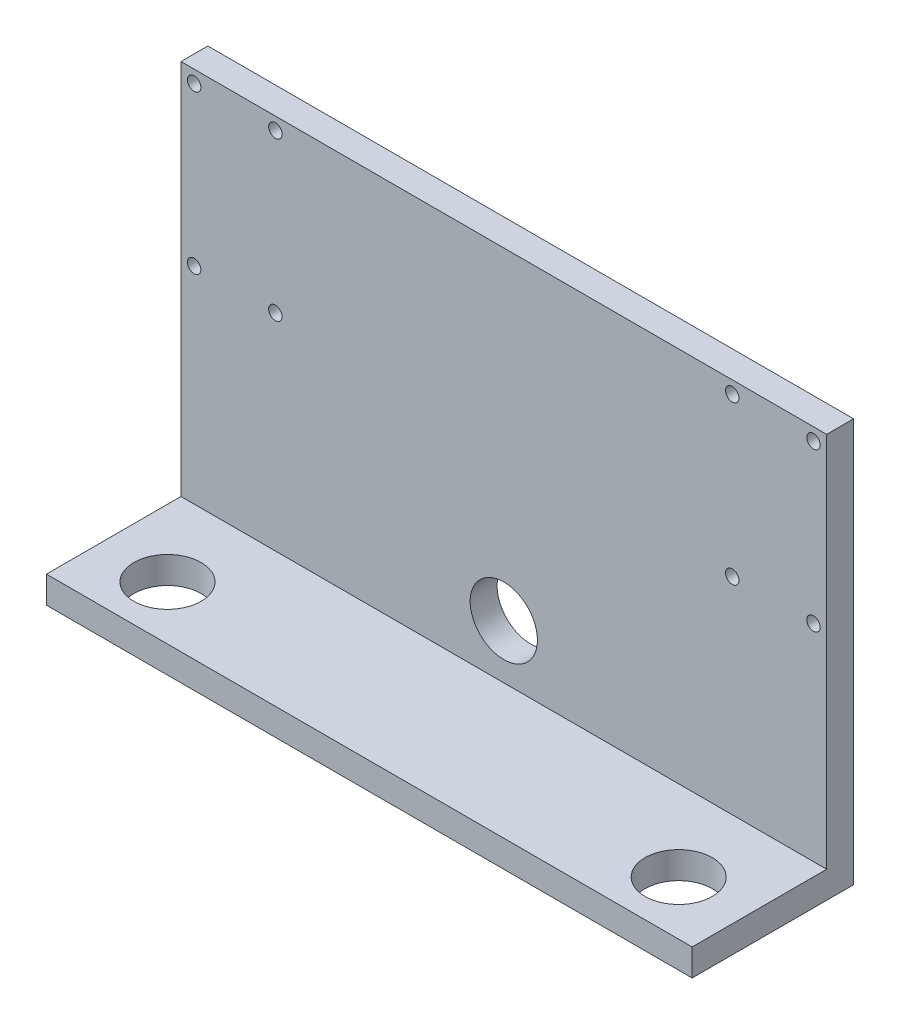
ISO-10303-21;
HEADER;
FILE_DESCRIPTION(('STEP AP214'),'2;1');
FILE_NAME('part.step','',(''),(''),'','','');
FILE_SCHEMA(('AUTOMOTIVE_DESIGN { 1 0 10303 214 1 1 1 1 }'));
ENDSEC;
DATA;
#1=APPLICATION_CONTEXT('core data for automotive mechanical design processes');
#2=APPLICATION_PROTOCOL_DEFINITION('international standard','automotive_design',2000,#1);
#3=PRODUCT_CONTEXT('',#1,'mechanical');
#4=PRODUCT('Part','Part','',(#3));
#5=PRODUCT_RELATED_PRODUCT_CATEGORY('part','',(#4));
#6=PRODUCT_DEFINITION_FORMATION('','',#4);
#7=PRODUCT_DEFINITION_CONTEXT('part definition',#1,'design');
#8=PRODUCT_DEFINITION('design','',#6,#7);
#9=PRODUCT_DEFINITION_SHAPE('','',#8);
#10=(LENGTH_UNIT() NAMED_UNIT(*) SI_UNIT(.MILLI.,.METRE.));
#11=(NAMED_UNIT(*) PLANE_ANGLE_UNIT() SI_UNIT($,.RADIAN.));
#12=(NAMED_UNIT(*) SI_UNIT($,.STERADIAN.) SOLID_ANGLE_UNIT());
#13=UNCERTAINTY_MEASURE_WITH_UNIT(LENGTH_MEASURE(1.E-05),#10,'distance_accuracy_value','');
#14=(GEOMETRIC_REPRESENTATION_CONTEXT(3) GLOBAL_UNCERTAINTY_ASSIGNED_CONTEXT((#13)) GLOBAL_UNIT_ASSIGNED_CONTEXT((#10,
#11,#12)) REPRESENTATION_CONTEXT('',''));
#15=CARTESIAN_POINT('',(0.,0.,0.));
#16=DIRECTION('',(0.,0.,1.));
#17=DIRECTION('',(1.,0.,0.));
#18=AXIS2_PLACEMENT_3D('',#15,#16,#17);
#19=CARTESIAN_POINT('',(-120.,150.,-20.));
#20=DIRECTION('',(0.,0.,-1.));
#21=DIRECTION('',(-1.,0.,0.));
#22=AXIS2_PLACEMENT_3D('',#19,#20,#21);
#23=PLANE('',#22);
#24=CARTESIAN_POINT('',(0.,30.,-20.));
#25=DIRECTION('',(0.,0.,1.));
#26=DIRECTION('',(1.,0.,0.));
#27=AXIS2_PLACEMENT_3D('',#24,#25,#26);
#28=CIRCLE('',#27,12.5);
#29=CARTESIAN_POINT('',(12.5,30.,-20.));
#30=VERTEX_POINT('',#29);
#31=EDGE_CURVE('E186',#30,#30,#28,.T.);
#32=ORIENTED_EDGE('',*,*,#31,.F.);
#33=EDGE_LOOP('',(#32));
#34=FACE_BOUND('',#33,.T.);
#35=DIRECTION('',(1.,0.,0.));
#36=VECTOR('',#35,1.);
#37=CARTESIAN_POINT('',(-120.,10.,-20.));
#38=LINE('',#37,#36);
#39=CARTESIAN_POINT('',(-120.,10.,-20.));
#40=VERTEX_POINT('',#39);
#41=CARTESIAN_POINT('',(120.,10.,-20.));
#42=VERTEX_POINT('',#41);
#43=EDGE_CURVE('E34',#40,#42,#38,.T.);
#44=ORIENTED_EDGE('',*,*,#43,.T.);
#45=DIRECTION('',(0.,-1.,0.));
#46=VECTOR('',#45,1.);
#47=CARTESIAN_POINT('',(120.,150.,-20.));
#48=LINE('',#47,#46);
#49=CARTESIAN_POINT('',(120.,150.,-20.));
#50=VERTEX_POINT('',#49);
#51=EDGE_CURVE('E84',#50,#42,#48,.T.);
#52=ORIENTED_EDGE('',*,*,#51,.F.);
#53=DIRECTION('',(1.,0.,0.));
#54=VECTOR('',#53,1.);
#55=CARTESIAN_POINT('',(-120.,150.,-20.));
#56=LINE('',#55,#54);
#57=CARTESIAN_POINT('',(-120.,150.,-20.));
#58=VERTEX_POINT('',#57);
#59=EDGE_CURVE('E118',#58,#50,#56,.T.);
#60=ORIENTED_EDGE('',*,*,#59,.F.);
#61=DIRECTION('',(0.,-1.,0.));
#62=VECTOR('',#61,1.);
#63=CARTESIAN_POINT('',(-120.,150.,-20.));
#64=LINE('',#63,#62);
#65=EDGE_CURVE('E80',#58,#40,#64,.T.);
#66=ORIENTED_EDGE('',*,*,#65,.T.);
#67=EDGE_LOOP('',(#44,#52,#60,#66));
#68=FACE_BOUND('',#67,.T.);
#69=CARTESIAN_POINT('',(84.9,86.6500000000607,-20.));
#70=DIRECTION('',(0.,0.,1.));
#71=DIRECTION('',(1.,0.,0.));
#72=AXIS2_PLACEMENT_3D('',#69,#70,#71);
#73=CIRCLE('',#72,2.5);
#74=CARTESIAN_POINT('',(87.4,86.6500000000607,-20.));
#75=VERTEX_POINT('',#74);
#76=EDGE_CURVE('E138',#75,#75,#73,.T.);
#77=ORIENTED_EDGE('',*,*,#76,.F.);
#78=EDGE_LOOP('',(#77));
#79=FACE_BOUND('',#78,.T.);
#80=CARTESIAN_POINT('',(115.1,86.6500000000607,-20.));
#81=DIRECTION('',(0.,0.,1.));
#82=DIRECTION('',(1.,0.,0.));
#83=AXIS2_PLACEMENT_3D('',#80,#81,#82);
#84=CIRCLE('',#83,2.5);
#85=CARTESIAN_POINT('',(117.6,86.6500000000607,-20.));
#86=VERTEX_POINT('',#85);
#87=EDGE_CURVE('E144',#86,#86,#84,.T.);
#88=ORIENTED_EDGE('',*,*,#87,.F.);
#89=EDGE_LOOP('',(#88));
#90=FACE_BOUND('',#89,.T.);
#91=CARTESIAN_POINT('',(115.1,145.350000000061,-20.));
#92=DIRECTION('',(0.,0.,1.));
#93=DIRECTION('',(1.,0.,0.));
#94=AXIS2_PLACEMENT_3D('',#91,#92,#93);
#95=CIRCLE('',#94,2.5);
#96=CARTESIAN_POINT('',(117.6,145.350000000061,-20.));
#97=VERTEX_POINT('',#96);
#98=EDGE_CURVE('E150',#97,#97,#95,.T.);
#99=ORIENTED_EDGE('',*,*,#98,.F.);
#100=EDGE_LOOP('',(#99));
#101=FACE_BOUND('',#100,.T.);
#102=CARTESIAN_POINT('',(84.9,145.350000000061,-20.));
#103=DIRECTION('',(0.,0.,1.));
#104=DIRECTION('',(1.,0.,0.));
#105=AXIS2_PLACEMENT_3D('',#102,#103,#104);
#106=CIRCLE('',#105,2.5);
#107=CARTESIAN_POINT('',(87.4,145.350000000061,-20.));
#108=VERTEX_POINT('',#107);
#109=EDGE_CURVE('E156',#108,#108,#106,.T.);
#110=ORIENTED_EDGE('',*,*,#109,.F.);
#111=EDGE_LOOP('',(#110));
#112=FACE_BOUND('',#111,.T.);
#113=CARTESIAN_POINT('',(-115.1,86.6500000000607,-20.));
#114=DIRECTION('',(0.,0.,1.));
#115=DIRECTION('',(1.,0.,0.));
#116=AXIS2_PLACEMENT_3D('',#113,#114,#115);
#117=CIRCLE('',#116,2.5);
#118=CARTESIAN_POINT('',(-112.6,86.6500000000607,-20.));
#119=VERTEX_POINT('',#118);
#120=EDGE_CURVE('E162',#119,#119,#117,.T.);
#121=ORIENTED_EDGE('',*,*,#120,.F.);
#122=EDGE_LOOP('',(#121));
#123=FACE_BOUND('',#122,.T.);
#124=CARTESIAN_POINT('',(-84.9,86.6500000000607,-20.));
#125=DIRECTION('',(0.,0.,1.));
#126=DIRECTION('',(1.,0.,0.));
#127=AXIS2_PLACEMENT_3D('',#124,#125,#126);
#128=CIRCLE('',#127,2.5);
#129=CARTESIAN_POINT('',(-82.4,86.6500000000607,-20.));
#130=VERTEX_POINT('',#129);
#131=EDGE_CURVE('E168',#130,#130,#128,.T.);
#132=ORIENTED_EDGE('',*,*,#131,.F.);
#133=EDGE_LOOP('',(#132));
#134=FACE_BOUND('',#133,.T.);
#135=CARTESIAN_POINT('',(-84.9,145.350000000061,-20.));
#136=DIRECTION('',(0.,0.,1.));
#137=DIRECTION('',(1.,0.,0.));
#138=AXIS2_PLACEMENT_3D('',#135,#136,#137);
#139=CIRCLE('',#138,2.5);
#140=CARTESIAN_POINT('',(-82.4,145.350000000061,-20.));
#141=VERTEX_POINT('',#140);
#142=EDGE_CURVE('E174',#141,#141,#139,.T.);
#143=ORIENTED_EDGE('',*,*,#142,.F.);
#144=EDGE_LOOP('',(#143));
#145=FACE_BOUND('',#144,.T.);
#146=CARTESIAN_POINT('',(-115.1,145.350000000061,-20.));
#147=DIRECTION('',(0.,0.,1.));
#148=DIRECTION('',(1.,0.,0.));
#149=AXIS2_PLACEMENT_3D('',#146,#147,#148);
#150=CIRCLE('',#149,2.5);
#151=CARTESIAN_POINT('',(-112.6,145.350000000061,-20.));
#152=VERTEX_POINT('',#151);
#153=EDGE_CURVE('E180',#152,#152,#150,.T.);
#154=ORIENTED_EDGE('',*,*,#153,.F.);
#155=EDGE_LOOP('',(#154));
#156=FACE_BOUND('',#155,.T.);
#157=ADVANCED_FACE('F17',(#34,#68,#79,#90,#101,#112,#123,#134,#145,#156),#23,.F.);
#158=CARTESIAN_POINT('',(0.,10.,0.));
#159=DIRECTION('',(0.,-1.,0.));
#160=DIRECTION('',(0.,0.,-1.));
#161=AXIS2_PLACEMENT_3D('',#158,#159,#160);
#162=PLANE('',#161);
#163=CARTESIAN_POINT('',(-95.,10.,10.));
#164=DIRECTION('',(0.,1.,0.));
#165=DIRECTION('',(0.,0.,1.));
#166=AXIS2_PLACEMENT_3D('',#163,#164,#165);
#167=CIRCLE('',#166,12.5);
#168=CARTESIAN_POINT('',(-95.,10.,22.5));
#169=VERTEX_POINT('',#168);
#170=EDGE_CURVE('E132',#169,#169,#167,.T.);
#171=ORIENTED_EDGE('',*,*,#170,.F.);
#172=EDGE_LOOP('',(#171));
#173=FACE_BOUND('',#172,.T.);
#174=CARTESIAN_POINT('',(95.,10.,10.));
#175=DIRECTION('',(0.,1.,0.));
#176=DIRECTION('',(0.,0.,1.));
#177=AXIS2_PLACEMENT_3D('',#174,#175,#176);
#178=CIRCLE('',#177,12.5);
#179=CARTESIAN_POINT('',(95.,10.,22.5));
#180=VERTEX_POINT('',#179);
#181=EDGE_CURVE('E126',#180,#180,#178,.T.);
#182=ORIENTED_EDGE('',*,*,#181,.F.);
#183=EDGE_LOOP('',(#182));
#184=FACE_BOUND('',#183,.T.);
#185=ORIENTED_EDGE('',*,*,#43,.F.);
#186=DIRECTION('',(0.,0.,1.));
#187=VECTOR('',#186,1.);
#188=CARTESIAN_POINT('',(-120.,10.,30.));
#189=LINE('',#188,#187);
#190=CARTESIAN_POINT('',(-120.,10.,30.));
#191=VERTEX_POINT('',#190);
#192=EDGE_CURVE('E94',#40,#191,#189,.T.);
#193=ORIENTED_EDGE('',*,*,#192,.T.);
#194=DIRECTION('',(1.,0.,0.));
#195=VECTOR('',#194,1.);
#196=CARTESIAN_POINT('',(-120.,10.,30.));
#197=LINE('',#196,#195);
#198=CARTESIAN_POINT('',(120.,10.,30.));
#199=VERTEX_POINT('',#198);
#200=EDGE_CURVE('E40',#191,#199,#197,.T.);
#201=ORIENTED_EDGE('',*,*,#200,.T.);
#202=DIRECTION('',(0.,0.,-1.));
#203=VECTOR('',#202,1.);
#204=CARTESIAN_POINT('',(120.,10.,30.));
#205=LINE('',#204,#203);
#206=EDGE_CURVE('E69',#199,#42,#205,.T.);
#207=ORIENTED_EDGE('',*,*,#206,.T.);
#208=EDGE_LOOP('',(#185,#193,#201,#207));
#209=FACE_BOUND('',#208,.T.);
#210=ADVANCED_FACE('F194',(#173,#184,#209),#162,.F.);
#211=CARTESIAN_POINT('',(120.,10.,30.));
#212=DIRECTION('',(-1.,0.,0.));
#213=DIRECTION('',(0.,0.,1.));
#214=AXIS2_PLACEMENT_3D('',#211,#212,#213);
#215=PLANE('',#214);
#216=DIRECTION('',(0.,0.,-1.));
#217=VECTOR('',#216,1.);
#218=CARTESIAN_POINT('',(120.,0.,30.));
#219=LINE('',#218,#217);
#220=CARTESIAN_POINT('',(120.,0.,30.));
#221=VERTEX_POINT('',#220);
#222=CARTESIAN_POINT('',(120.,0.,-30.));
#223=VERTEX_POINT('',#222);
#224=EDGE_CURVE('E75',#221,#223,#219,.T.);
#225=ORIENTED_EDGE('',*,*,#224,.T.);
#226=DIRECTION('',(0.,-1.,0.));
#227=VECTOR('',#226,1.);
#228=CARTESIAN_POINT('',(120.,10.,-30.));
#229=LINE('',#228,#227);
#230=CARTESIAN_POINT('',(120.,150.,-30.));
#231=VERTEX_POINT('',#230);
#232=EDGE_CURVE('E11',#231,#223,#229,.T.);
#233=ORIENTED_EDGE('',*,*,#232,.F.);
#234=DIRECTION('',(0.,0.,-1.));
#235=VECTOR('',#234,1.);
#236=CARTESIAN_POINT('',(120.,150.,-30.));
#237=LINE('',#236,#235);
#238=EDGE_CURVE('E112',#50,#231,#237,.T.);
#239=ORIENTED_EDGE('',*,*,#238,.F.);
#240=ORIENTED_EDGE('',*,*,#51,.T.);
#241=ORIENTED_EDGE('',*,*,#206,.F.);
#242=DIRECTION('',(0.,-1.,0.));
#243=VECTOR('',#242,1.);
#244=CARTESIAN_POINT('',(120.,10.,30.));
#245=LINE('',#244,#243);
#246=EDGE_CURVE('E62',#199,#221,#245,.T.);
#247=ORIENTED_EDGE('',*,*,#246,.T.);
#248=EDGE_LOOP('',(#225,#233,#239,#240,#241,#247));
#249=FACE_BOUND('',#248,.T.);
#250=ADVANCED_FACE('F19',(#249),#215,.F.);
#251=CARTESIAN_POINT('',(-120.,10.,-30.));
#252=DIRECTION('',(0.,0.,1.));
#253=DIRECTION('',(1.,0.,0.));
#254=AXIS2_PLACEMENT_3D('',#251,#252,#253);
#255=PLANE('',#254);
#256=CARTESIAN_POINT('',(0.,30.,-30.));
#257=DIRECTION('',(0.,0.,1.));
#258=DIRECTION('',(1.,0.,0.));
#259=AXIS2_PLACEMENT_3D('',#256,#257,#258);
#260=CIRCLE('',#259,12.5);
#261=CARTESIAN_POINT('',(12.5,30.,-30.));
#262=VERTEX_POINT('',#261);
#263=EDGE_CURVE('E183',#262,#262,#260,.T.);
#264=ORIENTED_EDGE('',*,*,#263,.T.);
#265=EDGE_LOOP('',(#264));
#266=FACE_BOUND('',#265,.T.);
#267=CARTESIAN_POINT('',(-115.1,145.350000000061,-30.));
#268=DIRECTION('',(0.,0.,1.));
#269=DIRECTION('',(1.,0.,0.));
#270=AXIS2_PLACEMENT_3D('',#267,#268,#269);
#271=CIRCLE('',#270,2.5);
#272=CARTESIAN_POINT('',(-112.6,145.350000000061,-30.));
#273=VERTEX_POINT('',#272);
#274=EDGE_CURVE('E177',#273,#273,#271,.T.);
#275=ORIENTED_EDGE('',*,*,#274,.T.);
#276=EDGE_LOOP('',(#275));
#277=FACE_BOUND('',#276,.T.);
#278=CARTESIAN_POINT('',(-84.9,145.350000000061,-30.));
#279=DIRECTION('',(0.,0.,1.));
#280=DIRECTION('',(1.,0.,0.));
#281=AXIS2_PLACEMENT_3D('',#278,#279,#280);
#282=CIRCLE('',#281,2.5);
#283=CARTESIAN_POINT('',(-82.4,145.350000000061,-30.));
#284=VERTEX_POINT('',#283);
#285=EDGE_CURVE('E171',#284,#284,#282,.T.);
#286=ORIENTED_EDGE('',*,*,#285,.T.);
#287=EDGE_LOOP('',(#286));
#288=FACE_BOUND('',#287,.T.);
#289=CARTESIAN_POINT('',(-84.9,86.6500000000607,-30.));
#290=DIRECTION('',(0.,0.,1.));
#291=DIRECTION('',(1.,0.,0.));
#292=AXIS2_PLACEMENT_3D('',#289,#290,#291);
#293=CIRCLE('',#292,2.5);
#294=CARTESIAN_POINT('',(-82.4,86.6500000000607,-30.));
#295=VERTEX_POINT('',#294);
#296=EDGE_CURVE('E165',#295,#295,#293,.T.);
#297=ORIENTED_EDGE('',*,*,#296,.T.);
#298=EDGE_LOOP('',(#297));
#299=FACE_BOUND('',#298,.T.);
#300=CARTESIAN_POINT('',(-115.1,86.6500000000607,-30.));
#301=DIRECTION('',(0.,0.,1.));
#302=DIRECTION('',(1.,0.,0.));
#303=AXIS2_PLACEMENT_3D('',#300,#301,#302);
#304=CIRCLE('',#303,2.5);
#305=CARTESIAN_POINT('',(-112.6,86.6500000000607,-30.));
#306=VERTEX_POINT('',#305);
#307=EDGE_CURVE('E159',#306,#306,#304,.T.);
#308=ORIENTED_EDGE('',*,*,#307,.T.);
#309=EDGE_LOOP('',(#308));
#310=FACE_BOUND('',#309,.T.);
#311=CARTESIAN_POINT('',(84.9,145.350000000061,-30.));
#312=DIRECTION('',(0.,0.,1.));
#313=DIRECTION('',(1.,0.,0.));
#314=AXIS2_PLACEMENT_3D('',#311,#312,#313);
#315=CIRCLE('',#314,2.5);
#316=CARTESIAN_POINT('',(87.4,145.350000000061,-30.));
#317=VERTEX_POINT('',#316);
#318=EDGE_CURVE('E153',#317,#317,#315,.T.);
#319=ORIENTED_EDGE('',*,*,#318,.T.);
#320=EDGE_LOOP('',(#319));
#321=FACE_BOUND('',#320,.T.);
#322=CARTESIAN_POINT('',(115.1,145.350000000061,-30.));
#323=DIRECTION('',(0.,0.,1.));
#324=DIRECTION('',(1.,0.,0.));
#325=AXIS2_PLACEMENT_3D('',#322,#323,#324);
#326=CIRCLE('',#325,2.5);
#327=CARTESIAN_POINT('',(117.6,145.350000000061,-30.));
#328=VERTEX_POINT('',#327);
#329=EDGE_CURVE('E147',#328,#328,#326,.T.);
#330=ORIENTED_EDGE('',*,*,#329,.T.);
#331=EDGE_LOOP('',(#330));
#332=FACE_BOUND('',#331,.T.);
#333=CARTESIAN_POINT('',(115.1,86.6500000000607,-30.));
#334=DIRECTION('',(0.,0.,1.));
#335=DIRECTION('',(1.,0.,0.));
#336=AXIS2_PLACEMENT_3D('',#333,#334,#335);
#337=CIRCLE('',#336,2.5);
#338=CARTESIAN_POINT('',(117.6,86.6500000000607,-30.));
#339=VERTEX_POINT('',#338);
#340=EDGE_CURVE('E141',#339,#339,#337,.T.);
#341=ORIENTED_EDGE('',*,*,#340,.T.);
#342=EDGE_LOOP('',(#341));
#343=FACE_BOUND('',#342,.T.);
#344=CARTESIAN_POINT('',(84.9,86.6500000000607,-30.));
#345=DIRECTION('',(0.,0.,1.));
#346=DIRECTION('',(1.,0.,0.));
#347=AXIS2_PLACEMENT_3D('',#344,#345,#346);
#348=CIRCLE('',#347,2.5);
#349=CARTESIAN_POINT('',(87.4,86.6500000000607,-30.));
#350=VERTEX_POINT('',#349);
#351=EDGE_CURVE('E135',#350,#350,#348,.T.);
#352=ORIENTED_EDGE('',*,*,#351,.T.);
#353=EDGE_LOOP('',(#352));
#354=FACE_BOUND('',#353,.T.);
#355=DIRECTION('',(-1.,0.,0.));
#356=VECTOR('',#355,1.);
#357=CARTESIAN_POINT('',(-120.,0.,-30.));
#358=LINE('',#357,#356);
#359=CARTESIAN_POINT('',(-120.,0.,-30.));
#360=VERTEX_POINT('',#359);
#361=EDGE_CURVE('E79',#223,#360,#358,.T.);
#362=ORIENTED_EDGE('',*,*,#361,.T.);
#363=DIRECTION('',(0.,-1.,0.));
#364=VECTOR('',#363,1.);
#365=CARTESIAN_POINT('',(-120.,10.,-30.));
#366=LINE('',#365,#364);
#367=CARTESIAN_POINT('',(-120.,150.,-30.));
#368=VERTEX_POINT('',#367);
#369=EDGE_CURVE('E26',#368,#360,#366,.T.);
#370=ORIENTED_EDGE('',*,*,#369,.F.);
#371=DIRECTION('',(-1.,0.,0.));
#372=VECTOR('',#371,1.);
#373=CARTESIAN_POINT('',(-120.,150.,-30.));
#374=LINE('',#373,#372);
#375=EDGE_CURVE('E101',#231,#368,#374,.T.);
#376=ORIENTED_EDGE('',*,*,#375,.F.);
#377=ORIENTED_EDGE('',*,*,#232,.T.);
#378=EDGE_LOOP('',(#362,#370,#376,#377));
#379=FACE_BOUND('',#378,.T.);
#380=ADVANCED_FACE('F275',(#266,#277,#288,#299,#310,#321,#332,#343,#354,#379),#255,.F.);
#381=CARTESIAN_POINT('',(-120.,10.,30.));
#382=DIRECTION('',(1.,0.,0.));
#383=DIRECTION('',(0.,0.,-1.));
#384=AXIS2_PLACEMENT_3D('',#381,#382,#383);
#385=PLANE('',#384);
#386=DIRECTION('',(0.,0.,1.));
#387=VECTOR('',#386,1.);
#388=CARTESIAN_POINT('',(-120.,0.,30.));
#389=LINE('',#388,#387);
#390=CARTESIAN_POINT('',(-120.,0.,30.));
#391=VERTEX_POINT('',#390);
#392=EDGE_CURVE('E70',#360,#391,#389,.T.);
#393=ORIENTED_EDGE('',*,*,#392,.T.);
#394=DIRECTION('',(0.,-1.,0.));
#395=VECTOR('',#394,1.);
#396=CARTESIAN_POINT('',(-120.,10.,30.));
#397=LINE('',#396,#395);
#398=EDGE_CURVE('E65',#191,#391,#397,.T.);
#399=ORIENTED_EDGE('',*,*,#398,.F.);
#400=ORIENTED_EDGE('',*,*,#192,.F.);
#401=ORIENTED_EDGE('',*,*,#65,.F.);
#402=DIRECTION('',(0.,0.,1.));
#403=VECTOR('',#402,1.);
#404=CARTESIAN_POINT('',(-120.,150.,-30.));
#405=LINE('',#404,#403);
#406=EDGE_CURVE('E104',#368,#58,#405,.T.);
#407=ORIENTED_EDGE('',*,*,#406,.F.);
#408=ORIENTED_EDGE('',*,*,#369,.T.);
#409=EDGE_LOOP('',(#393,#399,#400,#401,#407,#408));
#410=FACE_BOUND('',#409,.T.);
#411=ADVANCED_FACE('F273',(#410),#385,.F.);
#412=CARTESIAN_POINT('',(-120.,10.,30.));
#413=DIRECTION('',(0.,0.,-1.));
#414=DIRECTION('',(-1.,0.,0.));
#415=AXIS2_PLACEMENT_3D('',#412,#413,#414);
#416=PLANE('',#415);
#417=DIRECTION('',(1.,0.,0.));
#418=VECTOR('',#417,1.);
#419=CARTESIAN_POINT('',(-120.,0.,30.));
#420=LINE('',#419,#418);
#421=EDGE_CURVE('E59',#391,#221,#420,.T.);
#422=ORIENTED_EDGE('',*,*,#421,.T.);
#423=ORIENTED_EDGE('',*,*,#246,.F.);
#424=ORIENTED_EDGE('',*,*,#200,.F.);
#425=ORIENTED_EDGE('',*,*,#398,.T.);
#426=EDGE_LOOP('',(#422,#423,#424,#425));
#427=FACE_BOUND('',#426,.T.);
#428=ADVANCED_FACE('F61',(#427),#416,.F.);
#429=CARTESIAN_POINT('',(0.,0.,0.));
#430=DIRECTION('',(0.,-1.,0.));
#431=DIRECTION('',(0.,0.,-1.));
#432=AXIS2_PLACEMENT_3D('',#429,#430,#431);
#433=PLANE('',#432);
#434=CARTESIAN_POINT('',(-95.,0.,10.));
#435=DIRECTION('',(0.,1.,0.));
#436=DIRECTION('',(0.,0.,1.));
#437=AXIS2_PLACEMENT_3D('',#434,#435,#436);
#438=CIRCLE('',#437,12.5);
#439=CARTESIAN_POINT('',(-95.,0.,22.5));
#440=VERTEX_POINT('',#439);
#441=EDGE_CURVE('E129',#440,#440,#438,.T.);
#442=ORIENTED_EDGE('',*,*,#441,.T.);
#443=EDGE_LOOP('',(#442));
#444=FACE_BOUND('',#443,.T.);
#445=CARTESIAN_POINT('',(95.,0.,10.));
#446=DIRECTION('',(0.,1.,0.));
#447=DIRECTION('',(0.,0.,1.));
#448=AXIS2_PLACEMENT_3D('',#445,#446,#447);
#449=CIRCLE('',#448,12.5);
#450=CARTESIAN_POINT('',(95.,0.,22.5));
#451=VERTEX_POINT('',#450);
#452=EDGE_CURVE('E105',#451,#451,#449,.T.);
#453=ORIENTED_EDGE('',*,*,#452,.T.);
#454=EDGE_LOOP('',(#453));
#455=FACE_BOUND('',#454,.T.);
#456=ORIENTED_EDGE('',*,*,#224,.F.);
#457=ORIENTED_EDGE('',*,*,#421,.F.);
#458=ORIENTED_EDGE('',*,*,#392,.F.);
#459=ORIENTED_EDGE('',*,*,#361,.F.);
#460=EDGE_LOOP('',(#456,#457,#458,#459));
#461=FACE_BOUND('',#460,.T.);
#462=ADVANCED_FACE('F78',(#444,#455,#461),#433,.T.);
#463=CARTESIAN_POINT('',(0.,150.,0.));
#464=DIRECTION('',(0.,1.,0.));
#465=DIRECTION('',(0.,0.,1.));
#466=AXIS2_PLACEMENT_3D('',#463,#464,#465);
#467=PLANE('',#466);
#468=ORIENTED_EDGE('',*,*,#406,.T.);
#469=ORIENTED_EDGE('',*,*,#59,.T.);
#470=ORIENTED_EDGE('',*,*,#238,.T.);
#471=ORIENTED_EDGE('',*,*,#375,.T.);
#472=EDGE_LOOP('',(#468,#469,#470,#471));
#473=FACE_BOUND('',#472,.T.);
#474=ADVANCED_FACE('F261',(#473),#467,.T.);
#475=CARTESIAN_POINT('',(95.,10.,10.));
#476=DIRECTION('',(0.,1.,0.));
#477=DIRECTION('',(0.,0.,1.));
#478=AXIS2_PLACEMENT_3D('',#475,#476,#477);
#479=CYLINDRICAL_SURFACE('',#478,12.5);
#480=ORIENTED_EDGE('',*,*,#452,.F.);
#481=EDGE_LOOP('',(#480));
#482=FACE_BOUND('',#481,.T.);
#483=ORIENTED_EDGE('',*,*,#181,.T.);
#484=EDGE_LOOP('',(#483));
#485=FACE_BOUND('',#484,.T.);
#486=ADVANCED_FACE('F257',(#482,#485),#479,.F.);
#487=CARTESIAN_POINT('',(-95.,10.,10.));
#488=DIRECTION('',(0.,1.,0.));
#489=DIRECTION('',(0.,0.,1.));
#490=AXIS2_PLACEMENT_3D('',#487,#488,#489);
#491=CYLINDRICAL_SURFACE('',#490,12.5);
#492=ORIENTED_EDGE('',*,*,#441,.F.);
#493=EDGE_LOOP('',(#492));
#494=FACE_BOUND('',#493,.T.);
#495=ORIENTED_EDGE('',*,*,#170,.T.);
#496=EDGE_LOOP('',(#495));
#497=FACE_BOUND('',#496,.T.);
#498=ADVANCED_FACE('F253',(#494,#497),#491,.F.);
#499=CARTESIAN_POINT('',(84.9,86.6500000000607,-20.));
#500=DIRECTION('',(0.,0.,1.));
#501=DIRECTION('',(1.,0.,0.));
#502=AXIS2_PLACEMENT_3D('',#499,#500,#501);
#503=CYLINDRICAL_SURFACE('',#502,2.5);
#504=ORIENTED_EDGE('',*,*,#351,.F.);
#505=EDGE_LOOP('',(#504));
#506=FACE_BOUND('',#505,.T.);
#507=ORIENTED_EDGE('',*,*,#76,.T.);
#508=EDGE_LOOP('',(#507));
#509=FACE_BOUND('',#508,.T.);
#510=ADVANCED_FACE('F249',(#506,#509),#503,.F.);
#511=CARTESIAN_POINT('',(115.1,86.6500000000607,-20.));
#512=DIRECTION('',(0.,0.,1.));
#513=DIRECTION('',(1.,0.,0.));
#514=AXIS2_PLACEMENT_3D('',#511,#512,#513);
#515=CYLINDRICAL_SURFACE('',#514,2.5);
#516=ORIENTED_EDGE('',*,*,#340,.F.);
#517=EDGE_LOOP('',(#516));
#518=FACE_BOUND('',#517,.T.);
#519=ORIENTED_EDGE('',*,*,#87,.T.);
#520=EDGE_LOOP('',(#519));
#521=FACE_BOUND('',#520,.T.);
#522=ADVANCED_FACE('F245',(#518,#521),#515,.F.);
#523=CARTESIAN_POINT('',(115.1,145.350000000061,-20.));
#524=DIRECTION('',(0.,0.,1.));
#525=DIRECTION('',(1.,0.,0.));
#526=AXIS2_PLACEMENT_3D('',#523,#524,#525);
#527=CYLINDRICAL_SURFACE('',#526,2.5);
#528=ORIENTED_EDGE('',*,*,#329,.F.);
#529=EDGE_LOOP('',(#528));
#530=FACE_BOUND('',#529,.T.);
#531=ORIENTED_EDGE('',*,*,#98,.T.);
#532=EDGE_LOOP('',(#531));
#533=FACE_BOUND('',#532,.T.);
#534=ADVANCED_FACE('F241',(#530,#533),#527,.F.);
#535=CARTESIAN_POINT('',(84.9,145.350000000061,-20.));
#536=DIRECTION('',(0.,0.,1.));
#537=DIRECTION('',(1.,0.,0.));
#538=AXIS2_PLACEMENT_3D('',#535,#536,#537);
#539=CYLINDRICAL_SURFACE('',#538,2.5);
#540=ORIENTED_EDGE('',*,*,#318,.F.);
#541=EDGE_LOOP('',(#540));
#542=FACE_BOUND('',#541,.T.);
#543=ORIENTED_EDGE('',*,*,#109,.T.);
#544=EDGE_LOOP('',(#543));
#545=FACE_BOUND('',#544,.T.);
#546=ADVANCED_FACE('F237',(#542,#545),#539,.F.);
#547=CARTESIAN_POINT('',(-115.1,86.6500000000607,-20.));
#548=DIRECTION('',(0.,0.,1.));
#549=DIRECTION('',(1.,0.,0.));
#550=AXIS2_PLACEMENT_3D('',#547,#548,#549);
#551=CYLINDRICAL_SURFACE('',#550,2.5);
#552=ORIENTED_EDGE('',*,*,#307,.F.);
#553=EDGE_LOOP('',(#552));
#554=FACE_BOUND('',#553,.T.);
#555=ORIENTED_EDGE('',*,*,#120,.T.);
#556=EDGE_LOOP('',(#555));
#557=FACE_BOUND('',#556,.T.);
#558=ADVANCED_FACE('F233',(#554,#557),#551,.F.);
#559=CARTESIAN_POINT('',(-84.9,86.6500000000607,-20.));
#560=DIRECTION('',(0.,0.,1.));
#561=DIRECTION('',(1.,0.,0.));
#562=AXIS2_PLACEMENT_3D('',#559,#560,#561);
#563=CYLINDRICAL_SURFACE('',#562,2.5);
#564=ORIENTED_EDGE('',*,*,#296,.F.);
#565=EDGE_LOOP('',(#564));
#566=FACE_BOUND('',#565,.T.);
#567=ORIENTED_EDGE('',*,*,#131,.T.);
#568=EDGE_LOOP('',(#567));
#569=FACE_BOUND('',#568,.T.);
#570=ADVANCED_FACE('F226',(#566,#569),#563,.F.);
#571=CARTESIAN_POINT('',(-84.9,145.350000000061,-20.));
#572=DIRECTION('',(0.,0.,1.));
#573=DIRECTION('',(1.,0.,0.));
#574=AXIS2_PLACEMENT_3D('',#571,#572,#573);
#575=CYLINDRICAL_SURFACE('',#574,2.5);
#576=ORIENTED_EDGE('',*,*,#285,.F.);
#577=EDGE_LOOP('',(#576));
#578=FACE_BOUND('',#577,.T.);
#579=ORIENTED_EDGE('',*,*,#142,.T.);
#580=EDGE_LOOP('',(#579));
#581=FACE_BOUND('',#580,.T.);
#582=ADVANCED_FACE('F215',(#578,#581),#575,.F.);
#583=CARTESIAN_POINT('',(-115.1,145.350000000061,-20.));
#584=DIRECTION('',(0.,0.,1.));
#585=DIRECTION('',(1.,0.,0.));
#586=AXIS2_PLACEMENT_3D('',#583,#584,#585);
#587=CYLINDRICAL_SURFACE('',#586,2.5);
#588=ORIENTED_EDGE('',*,*,#274,.F.);
#589=EDGE_LOOP('',(#588));
#590=FACE_BOUND('',#589,.T.);
#591=ORIENTED_EDGE('',*,*,#153,.T.);
#592=EDGE_LOOP('',(#591));
#593=FACE_BOUND('',#592,.T.);
#594=ADVANCED_FACE('F213',(#590,#593),#587,.F.);
#595=CARTESIAN_POINT('',(0.,30.,-20.));
#596=DIRECTION('',(0.,0.,1.));
#597=DIRECTION('',(1.,0.,0.));
#598=AXIS2_PLACEMENT_3D('',#595,#596,#597);
#599=CYLINDRICAL_SURFACE('',#598,12.5);
#600=ORIENTED_EDGE('',*,*,#263,.F.);
#601=EDGE_LOOP('',(#600));
#602=FACE_BOUND('',#601,.T.);
#603=ORIENTED_EDGE('',*,*,#31,.T.);
#604=EDGE_LOOP('',(#603));
#605=FACE_BOUND('',#604,.T.);
#606=ADVANCED_FACE('F190',(#602,#605),#599,.F.);
#607=CLOSED_SHELL('',(#157,#210,#250,#380,#411,#428,#462,#474,#486,#498,#510,#522,#534,#546,
#558,#570,#582,#594,#606));
#608=MANIFOLD_SOLID_BREP('B1',#607);
#609=ADVANCED_BREP_SHAPE_REPRESENTATION('',(#18,#608),#14);
#610=SHAPE_DEFINITION_REPRESENTATION(#9,#609);
ENDSEC;
END-ISO-10303-21;
